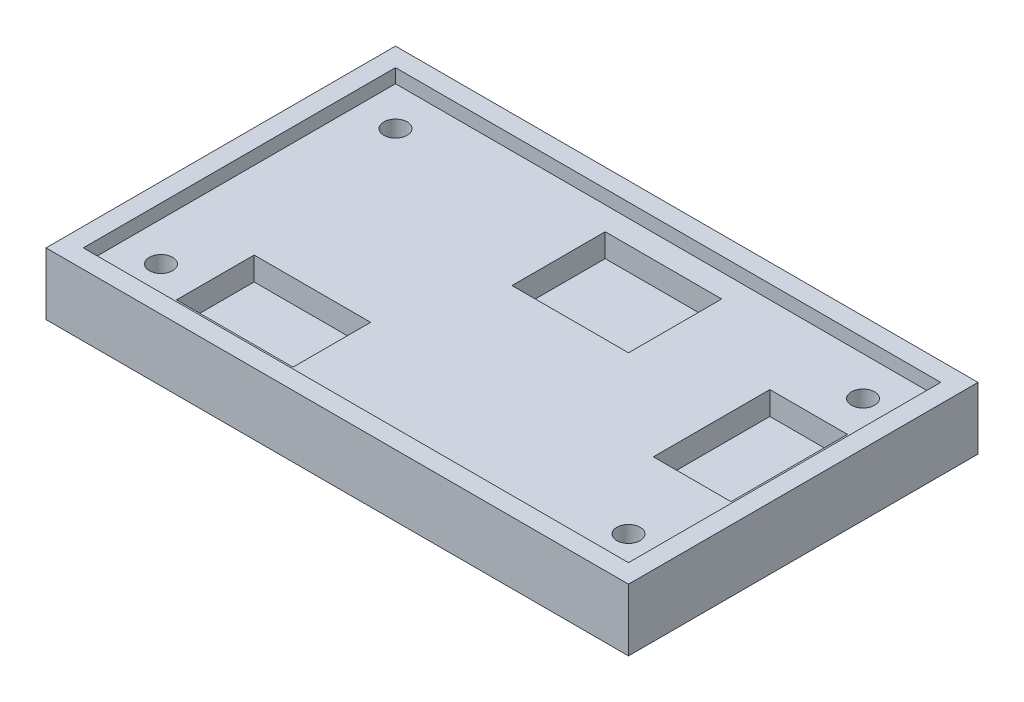
ISO-10303-21;
HEADER;
FILE_DESCRIPTION(('STEP AP214'),'2;1');
FILE_NAME('part.step','',(''),(''),'','','');
FILE_SCHEMA(('AUTOMOTIVE_DESIGN { 1 0 10303 214 1 1 1 1 }'));
ENDSEC;
DATA;
#1=APPLICATION_CONTEXT('core data for automotive mechanical design processes');
#2=APPLICATION_PROTOCOL_DEFINITION('international standard','automotive_design',2000,#1);
#3=PRODUCT_CONTEXT('',#1,'mechanical');
#4=PRODUCT('Part','Part','',(#3));
#5=PRODUCT_RELATED_PRODUCT_CATEGORY('part','',(#4));
#6=PRODUCT_DEFINITION_FORMATION('','',#4);
#7=PRODUCT_DEFINITION_CONTEXT('part definition',#1,'design');
#8=PRODUCT_DEFINITION('design','',#6,#7);
#9=PRODUCT_DEFINITION_SHAPE('','',#8);
#10=(LENGTH_UNIT() NAMED_UNIT(*) SI_UNIT(.MILLI.,.METRE.));
#11=(NAMED_UNIT(*) PLANE_ANGLE_UNIT() SI_UNIT($,.RADIAN.));
#12=(NAMED_UNIT(*) SI_UNIT($,.STERADIAN.) SOLID_ANGLE_UNIT());
#13=UNCERTAINTY_MEASURE_WITH_UNIT(LENGTH_MEASURE(1.E-05),#10,'distance_accuracy_value','');
#14=(GEOMETRIC_REPRESENTATION_CONTEXT(3) GLOBAL_UNCERTAINTY_ASSIGNED_CONTEXT((#13)) GLOBAL_UNIT_ASSIGNED_CONTEXT((#10,
#11,#12)) REPRESENTATION_CONTEXT('',''));
#15=CARTESIAN_POINT('',(0.,0.,0.));
#16=DIRECTION('',(0.,0.,1.));
#17=DIRECTION('',(1.,0.,0.));
#18=AXIS2_PLACEMENT_3D('',#15,#16,#17);
#19=CARTESIAN_POINT('',(0.,8.,-45.));
#20=DIRECTION('',(0.,0.,-1.));
#21=DIRECTION('',(-1.,0.,0.));
#22=AXIS2_PLACEMENT_3D('',#19,#20,#21);
#23=PLANE('',#22);
#24=DIRECTION('',(1.,0.,0.));
#25=VECTOR('',#24,1.);
#26=CARTESIAN_POINT('',(0.,0.,-45.));
#27=LINE('',#26,#25);
#28=CARTESIAN_POINT('',(0.,0.,-45.));
#29=VERTEX_POINT('',#28);
#30=CARTESIAN_POINT('',(75.,0.,-45.));
#31=VERTEX_POINT('',#30);
#32=EDGE_CURVE('E328',#29,#31,#27,.T.);
#33=ORIENTED_EDGE('',*,*,#32,.F.);
#34=DIRECTION('',(0.,-1.,0.));
#35=VECTOR('',#34,1.);
#36=CARTESIAN_POINT('',(0.,8.,-45.));
#37=LINE('',#36,#35);
#38=CARTESIAN_POINT('',(0.,8.,-45.));
#39=VERTEX_POINT('',#38);
#40=EDGE_CURVE('E11',#39,#29,#37,.T.);
#41=ORIENTED_EDGE('',*,*,#40,.F.);
#42=DIRECTION('',(1.,0.,0.));
#43=VECTOR('',#42,1.);
#44=CARTESIAN_POINT('',(0.,8.,-45.));
#45=LINE('',#44,#43);
#46=CARTESIAN_POINT('',(75.,8.,-45.));
#47=VERTEX_POINT('',#46);
#48=EDGE_CURVE('E335',#39,#47,#45,.T.);
#49=ORIENTED_EDGE('',*,*,#48,.T.);
#50=DIRECTION('',(0.,-1.,0.));
#51=VECTOR('',#50,1.);
#52=CARTESIAN_POINT('',(75.,8.,-45.));
#53=LINE('',#52,#51);
#54=EDGE_CURVE('E44',#47,#31,#53,.T.);
#55=ORIENTED_EDGE('',*,*,#54,.T.);
#56=EDGE_LOOP('',(#33,#41,#49,#55));
#57=FACE_BOUND('',#56,.T.);
#58=ADVANCED_FACE('F41',(#57),#23,.T.);
#59=CARTESIAN_POINT('',(0.,8.,0.));
#60=DIRECTION('',(-1.,0.,0.));
#61=DIRECTION('',(0.,0.,1.));
#62=AXIS2_PLACEMENT_3D('',#59,#60,#61);
#63=PLANE('',#62);
#64=DIRECTION('',(0.,0.,-1.));
#65=VECTOR('',#64,1.);
#66=CARTESIAN_POINT('',(0.,0.,0.));
#67=LINE('',#66,#65);
#68=CARTESIAN_POINT('',(0.,0.,0.));
#69=VERTEX_POINT('',#68);
#70=EDGE_CURVE('E339',#69,#29,#67,.T.);
#71=ORIENTED_EDGE('',*,*,#70,.F.);
#72=DIRECTION('',(0.,-1.,0.));
#73=VECTOR('',#72,1.);
#74=CARTESIAN_POINT('',(0.,8.,0.));
#75=LINE('',#74,#73);
#76=CARTESIAN_POINT('',(0.,8.,0.));
#77=VERTEX_POINT('',#76);
#78=EDGE_CURVE('E49',#77,#69,#75,.T.);
#79=ORIENTED_EDGE('',*,*,#78,.F.);
#80=DIRECTION('',(0.,0.,-1.));
#81=VECTOR('',#80,1.);
#82=CARTESIAN_POINT('',(0.,8.,0.));
#83=LINE('',#82,#81);
#84=EDGE_CURVE('E343',#77,#39,#83,.T.);
#85=ORIENTED_EDGE('',*,*,#84,.T.);
#86=ORIENTED_EDGE('',*,*,#40,.T.);
#87=EDGE_LOOP('',(#71,#79,#85,#86));
#88=FACE_BOUND('',#87,.T.);
#89=ADVANCED_FACE('F371',(#88),#63,.T.);
#90=CARTESIAN_POINT('',(0.,8.,0.));
#91=DIRECTION('',(0.,0.,-1.));
#92=DIRECTION('',(-1.,0.,0.));
#93=AXIS2_PLACEMENT_3D('',#90,#91,#92);
#94=PLANE('',#93);
#95=DIRECTION('',(1.,0.,0.));
#96=VECTOR('',#95,1.);
#97=CARTESIAN_POINT('',(0.,0.,0.));
#98=LINE('',#97,#96);
#99=CARTESIAN_POINT('',(75.,0.,0.));
#100=VERTEX_POINT('',#99);
#101=EDGE_CURVE('E351',#69,#100,#98,.T.);
#102=ORIENTED_EDGE('',*,*,#101,.T.);
#103=DIRECTION('',(0.,-1.,0.));
#104=VECTOR('',#103,1.);
#105=CARTESIAN_POINT('',(75.,8.,0.));
#106=LINE('',#105,#104);
#107=CARTESIAN_POINT('',(75.,8.,0.));
#108=VERTEX_POINT('',#107);
#109=EDGE_CURVE('E355',#108,#100,#106,.T.);
#110=ORIENTED_EDGE('',*,*,#109,.F.);
#111=DIRECTION('',(1.,0.,0.));
#112=VECTOR('',#111,1.);
#113=CARTESIAN_POINT('',(0.,8.,0.));
#114=LINE('',#113,#112);
#115=EDGE_CURVE('E341',#77,#108,#114,.T.);
#116=ORIENTED_EDGE('',*,*,#115,.F.);
#117=ORIENTED_EDGE('',*,*,#78,.T.);
#118=EDGE_LOOP('',(#102,#110,#116,#117));
#119=FACE_BOUND('',#118,.T.);
#120=ADVANCED_FACE('F377',(#119),#94,.F.);
#121=CARTESIAN_POINT('',(75.,8.,0.));
#122=DIRECTION('',(-1.,0.,0.));
#123=DIRECTION('',(0.,0.,1.));
#124=AXIS2_PLACEMENT_3D('',#121,#122,#123);
#125=PLANE('',#124);
#126=DIRECTION('',(0.,0.,-1.));
#127=VECTOR('',#126,1.);
#128=CARTESIAN_POINT('',(75.,0.,0.));
#129=LINE('',#128,#127);
#130=EDGE_CURVE('E348',#100,#31,#129,.T.);
#131=ORIENTED_EDGE('',*,*,#130,.T.);
#132=ORIENTED_EDGE('',*,*,#54,.F.);
#133=DIRECTION('',(0.,0.,-1.));
#134=VECTOR('',#133,1.);
#135=CARTESIAN_POINT('',(75.,8.,0.));
#136=LINE('',#135,#134);
#137=EDGE_CURVE('E338',#108,#47,#136,.T.);
#138=ORIENTED_EDGE('',*,*,#137,.F.);
#139=ORIENTED_EDGE('',*,*,#109,.T.);
#140=EDGE_LOOP('',(#131,#132,#138,#139));
#141=FACE_BOUND('',#140,.T.);
#142=ADVANCED_FACE('F365',(#141),#125,.F.);
#143=CARTESIAN_POINT('',(0.,8.,0.));
#144=DIRECTION('',(0.,1.,0.));
#145=DIRECTION('',(0.,0.,1.));
#146=AXIS2_PLACEMENT_3D('',#143,#144,#145);
#147=PLANE('',#146);
#148=DIRECTION('',(0.,0.,1.));
#149=VECTOR('',#148,1.);
#150=CARTESIAN_POINT('',(2.4,8.,-42.6));
#151=LINE('',#150,#149);
#152=CARTESIAN_POINT('',(2.4,8.,-42.6));
#153=VERTEX_POINT('',#152);
#154=CARTESIAN_POINT('',(2.4,8.,-2.4));
#155=VERTEX_POINT('',#154);
#156=EDGE_CURVE('E300',#153,#155,#151,.T.);
#157=ORIENTED_EDGE('',*,*,#156,.F.);
#158=DIRECTION('',(-1.,0.,0.));
#159=VECTOR('',#158,1.);
#160=CARTESIAN_POINT('',(72.6,8.,-42.6));
#161=LINE('',#160,#159);
#162=CARTESIAN_POINT('',(72.6,8.,-42.6));
#163=VERTEX_POINT('',#162);
#164=EDGE_CURVE('E307',#163,#153,#161,.T.);
#165=ORIENTED_EDGE('',*,*,#164,.F.);
#166=DIRECTION('',(0.,0.,-1.));
#167=VECTOR('',#166,1.);
#168=CARTESIAN_POINT('',(72.6,8.,-2.4));
#169=LINE('',#168,#167);
#170=CARTESIAN_POINT('',(72.6,8.,-2.4));
#171=VERTEX_POINT('',#170);
#172=EDGE_CURVE('E321',#171,#163,#169,.T.);
#173=ORIENTED_EDGE('',*,*,#172,.F.);
#174=DIRECTION('',(1.,0.,0.));
#175=VECTOR('',#174,1.);
#176=CARTESIAN_POINT('',(2.4,8.,-2.4));
#177=LINE('',#176,#175);
#178=EDGE_CURVE('E318',#155,#171,#177,.T.);
#179=ORIENTED_EDGE('',*,*,#178,.F.);
#180=EDGE_LOOP('',(#157,#165,#173,#179));
#181=FACE_BOUND('',#180,.T.);
#182=ORIENTED_EDGE('',*,*,#48,.F.);
#183=ORIENTED_EDGE('',*,*,#84,.F.);
#184=ORIENTED_EDGE('',*,*,#115,.T.);
#185=ORIENTED_EDGE('',*,*,#137,.T.);
#186=EDGE_LOOP('',(#182,#183,#184,#185));
#187=FACE_BOUND('',#186,.T.);
#188=ADVANCED_FACE('F375',(#181,#187),#147,.T.);
#189=CARTESIAN_POINT('',(0.,0.,0.));
#190=DIRECTION('',(0.,1.,0.));
#191=DIRECTION('',(0.,0.,1.));
#192=AXIS2_PLACEMENT_3D('',#189,#190,#191);
#193=PLANE('',#192);
#194=ORIENTED_EDGE('',*,*,#32,.T.);
#195=ORIENTED_EDGE('',*,*,#130,.F.);
#196=ORIENTED_EDGE('',*,*,#101,.F.);
#197=ORIENTED_EDGE('',*,*,#70,.T.);
#198=EDGE_LOOP('',(#194,#195,#196,#197));
#199=FACE_BOUND('',#198,.T.);
#200=ADVANCED_FACE('F368',(#199),#193,.F.);
#201=CARTESIAN_POINT('',(2.4,6.2,-42.6));
#202=DIRECTION('',(-1.,0.,0.));
#203=DIRECTION('',(0.,0.,1.));
#204=AXIS2_PLACEMENT_3D('',#201,#202,#203);
#205=PLANE('',#204);
#206=ORIENTED_EDGE('',*,*,#156,.T.);
#207=DIRECTION('',(0.,1.,0.));
#208=VECTOR('',#207,1.);
#209=CARTESIAN_POINT('',(2.4,6.2,-2.4));
#210=LINE('',#209,#208);
#211=CARTESIAN_POINT('',(2.4,6.2,-2.4));
#212=VERTEX_POINT('',#211);
#213=EDGE_CURVE('E316',#212,#155,#210,.T.);
#214=ORIENTED_EDGE('',*,*,#213,.F.);
#215=DIRECTION('',(0.,0.,1.));
#216=VECTOR('',#215,1.);
#217=CARTESIAN_POINT('',(2.4,6.2,-42.6));
#218=LINE('',#217,#216);
#219=CARTESIAN_POINT('',(2.4,6.2,-42.6));
#220=VERTEX_POINT('',#219);
#221=EDGE_CURVE('E303',#220,#212,#218,.T.);
#222=ORIENTED_EDGE('',*,*,#221,.F.);
#223=DIRECTION('',(0.,1.,0.));
#224=VECTOR('',#223,1.);
#225=CARTESIAN_POINT('',(2.4,6.2,-42.6));
#226=LINE('',#225,#224);
#227=EDGE_CURVE('E326',#220,#153,#226,.T.);
#228=ORIENTED_EDGE('',*,*,#227,.T.);
#229=EDGE_LOOP('',(#206,#214,#222,#228));
#230=FACE_BOUND('',#229,.T.);
#231=ADVANCED_FACE('F423',(#230),#205,.F.);
#232=CARTESIAN_POINT('',(72.6,6.2,-42.6));
#233=DIRECTION('',(0.,0.,-1.));
#234=DIRECTION('',(-1.,0.,0.));
#235=AXIS2_PLACEMENT_3D('',#232,#233,#234);
#236=PLANE('',#235);
#237=ORIENTED_EDGE('',*,*,#164,.T.);
#238=ORIENTED_EDGE('',*,*,#227,.F.);
#239=DIRECTION('',(-1.,0.,0.));
#240=VECTOR('',#239,1.);
#241=CARTESIAN_POINT('',(72.6,6.2,-42.6));
#242=LINE('',#241,#240);
#243=CARTESIAN_POINT('',(72.6,6.2,-42.6));
#244=VERTEX_POINT('',#243);
#245=EDGE_CURVE('E313',#244,#220,#242,.T.);
#246=ORIENTED_EDGE('',*,*,#245,.F.);
#247=DIRECTION('',(0.,1.,0.));
#248=VECTOR('',#247,1.);
#249=CARTESIAN_POINT('',(72.6,6.2,-42.6));
#250=LINE('',#249,#248);
#251=EDGE_CURVE('E329',#244,#163,#250,.T.);
#252=ORIENTED_EDGE('',*,*,#251,.T.);
#253=EDGE_LOOP('',(#237,#238,#246,#252));
#254=FACE_BOUND('',#253,.T.);
#255=ADVANCED_FACE('F431',(#254),#236,.F.);
#256=CARTESIAN_POINT('',(72.6,6.2,-2.4));
#257=DIRECTION('',(1.,0.,0.));
#258=DIRECTION('',(0.,0.,-1.));
#259=AXIS2_PLACEMENT_3D('',#256,#257,#258);
#260=PLANE('',#259);
#261=ORIENTED_EDGE('',*,*,#172,.T.);
#262=ORIENTED_EDGE('',*,*,#251,.F.);
#263=DIRECTION('',(0.,0.,-1.));
#264=VECTOR('',#263,1.);
#265=CARTESIAN_POINT('',(72.6,6.2,-2.4));
#266=LINE('',#265,#264);
#267=CARTESIAN_POINT('',(72.6,6.2,-2.4));
#268=VERTEX_POINT('',#267);
#269=EDGE_CURVE('E310',#268,#244,#266,.T.);
#270=ORIENTED_EDGE('',*,*,#269,.F.);
#271=DIRECTION('',(0.,1.,0.));
#272=VECTOR('',#271,1.);
#273=CARTESIAN_POINT('',(72.6,6.2,-2.4));
#274=LINE('',#273,#272);
#275=EDGE_CURVE('E331',#268,#171,#274,.T.);
#276=ORIENTED_EDGE('',*,*,#275,.T.);
#277=EDGE_LOOP('',(#261,#262,#270,#276));
#278=FACE_BOUND('',#277,.T.);
#279=ADVANCED_FACE('F441',(#278),#260,.F.);
#280=CARTESIAN_POINT('',(2.4,6.2,-2.4));
#281=DIRECTION('',(0.,0.,1.));
#282=DIRECTION('',(1.,0.,0.));
#283=AXIS2_PLACEMENT_3D('',#280,#281,#282);
#284=PLANE('',#283);
#285=ORIENTED_EDGE('',*,*,#178,.T.);
#286=ORIENTED_EDGE('',*,*,#275,.F.);
#287=DIRECTION('',(1.,0.,0.));
#288=VECTOR('',#287,1.);
#289=CARTESIAN_POINT('',(2.4,6.2,-2.4));
#290=LINE('',#289,#288);
#291=EDGE_CURVE('E306',#212,#268,#290,.T.);
#292=ORIENTED_EDGE('',*,*,#291,.F.);
#293=ORIENTED_EDGE('',*,*,#213,.T.);
#294=EDGE_LOOP('',(#285,#286,#292,#293));
#295=FACE_BOUND('',#294,.T.);
#296=ADVANCED_FACE('F451',(#295),#284,.F.);
#297=CARTESIAN_POINT('',(0.,6.2,0.));
#298=DIRECTION('',(0.,1.,0.));
#299=DIRECTION('',(0.,0.,1.));
#300=AXIS2_PLACEMENT_3D('',#297,#298,#299);
#301=PLANE('',#300);
#302=DIRECTION('',(0.,0.,1.));
#303=VECTOR('',#302,1.);
#304=CARTESIAN_POINT('',(12.4,6.2,-14.4));
#305=LINE('',#304,#303);
#306=CARTESIAN_POINT('',(12.4,6.2,-14.4));
#307=VERTEX_POINT('',#306);
#308=CARTESIAN_POINT('',(12.4,6.2,-4.4));
#309=VERTEX_POINT('',#308);
#310=EDGE_CURVE('E57',#307,#309,#305,.T.);
#311=ORIENTED_EDGE('',*,*,#310,.F.);
#312=DIRECTION('',(-1.,0.,0.));
#313=VECTOR('',#312,1.);
#314=CARTESIAN_POINT('',(12.4,6.2,-14.4));
#315=LINE('',#314,#313);
#316=CARTESIAN_POINT('',(27.4,6.2,-14.4));
#317=VERTEX_POINT('',#316);
#318=EDGE_CURVE('E198',#317,#307,#315,.T.);
#319=ORIENTED_EDGE('',*,*,#318,.F.);
#320=DIRECTION('',(0.,0.,-1.));
#321=VECTOR('',#320,1.);
#322=CARTESIAN_POINT('',(27.4,6.2,-14.4));
#323=LINE('',#322,#321);
#324=CARTESIAN_POINT('',(27.4,6.2,-4.4));
#325=VERTEX_POINT('',#324);
#326=EDGE_CURVE('E201',#325,#317,#323,.T.);
#327=ORIENTED_EDGE('',*,*,#326,.F.);
#328=DIRECTION('',(1.,0.,0.));
#329=VECTOR('',#328,1.);
#330=CARTESIAN_POINT('',(12.4,6.2,-4.4));
#331=LINE('',#330,#329);
#332=EDGE_CURVE('E207',#309,#325,#331,.T.);
#333=ORIENTED_EDGE('',*,*,#332,.F.);
#334=EDGE_LOOP('',(#311,#319,#327,#333));
#335=FACE_BOUND('',#334,.T.);
#336=DIRECTION('',(0.,0.,1.));
#337=VECTOR('',#336,1.);
#338=CARTESIAN_POINT('',(60.6,6.2,-32.6));
#339=LINE('',#338,#337);
#340=CARTESIAN_POINT('',(60.6,6.2,-32.6));
#341=VERTEX_POINT('',#340);
#342=CARTESIAN_POINT('',(60.6,6.2,-17.6));
#343=VERTEX_POINT('',#342);
#344=EDGE_CURVE('E65',#341,#343,#339,.T.);
#345=ORIENTED_EDGE('',*,*,#344,.F.);
#346=DIRECTION('',(-1.,0.,0.));
#347=VECTOR('',#346,1.);
#348=CARTESIAN_POINT('',(60.6,6.2,-32.6));
#349=LINE('',#348,#347);
#350=CARTESIAN_POINT('',(70.6,6.2,-32.6));
#351=VERTEX_POINT('',#350);
#352=EDGE_CURVE('E227',#351,#341,#349,.T.);
#353=ORIENTED_EDGE('',*,*,#352,.F.);
#354=DIRECTION('',(0.,0.,-1.));
#355=VECTOR('',#354,1.);
#356=CARTESIAN_POINT('',(70.6,6.2,-32.6));
#357=LINE('',#356,#355);
#358=CARTESIAN_POINT('',(70.6,6.2,-17.6));
#359=VERTEX_POINT('',#358);
#360=EDGE_CURVE('E230',#359,#351,#357,.T.);
#361=ORIENTED_EDGE('',*,*,#360,.F.);
#362=DIRECTION('',(1.,0.,0.));
#363=VECTOR('',#362,1.);
#364=CARTESIAN_POINT('',(60.6,6.2,-17.6));
#365=LINE('',#364,#363);
#366=EDGE_CURVE('E234',#343,#359,#365,.T.);
#367=ORIENTED_EDGE('',*,*,#366,.F.);
#368=EDGE_LOOP('',(#345,#353,#361,#367));
#369=FACE_BOUND('',#368,.T.);
#370=DIRECTION('',(0.,0.,1.));
#371=VECTOR('',#370,1.);
#372=CARTESIAN_POINT('',(32.4,6.2,-39.6));
#373=LINE('',#372,#371);
#374=CARTESIAN_POINT('',(32.4,6.2,-39.6));
#375=VERTEX_POINT('',#374);
#376=CARTESIAN_POINT('',(32.4,6.2,-27.6));
#377=VERTEX_POINT('',#376);
#378=EDGE_CURVE('E226',#375,#377,#373,.T.);
#379=ORIENTED_EDGE('',*,*,#378,.F.);
#380=DIRECTION('',(-1.,0.,0.));
#381=VECTOR('',#380,1.);
#382=CARTESIAN_POINT('',(32.4,6.2,-39.6));
#383=LINE('',#382,#381);
#384=CARTESIAN_POINT('',(47.4,6.2,-39.6));
#385=VERTEX_POINT('',#384);
#386=EDGE_CURVE('E258',#385,#375,#383,.T.);
#387=ORIENTED_EDGE('',*,*,#386,.F.);
#388=DIRECTION('',(0.,0.,-1.));
#389=VECTOR('',#388,1.);
#390=CARTESIAN_POINT('',(47.4,6.2,-39.6));
#391=LINE('',#390,#389);
#392=CARTESIAN_POINT('',(47.4,6.2,-27.6));
#393=VERTEX_POINT('',#392);
#394=EDGE_CURVE('E261',#393,#385,#391,.T.);
#395=ORIENTED_EDGE('',*,*,#394,.F.);
#396=DIRECTION('',(1.,0.,0.));
#397=VECTOR('',#396,1.);
#398=CARTESIAN_POINT('',(32.4,6.2,-27.6));
#399=LINE('',#398,#397);
#400=EDGE_CURVE('E265',#377,#393,#399,.T.);
#401=ORIENTED_EDGE('',*,*,#400,.F.);
#402=EDGE_LOOP('',(#379,#387,#395,#401));
#403=FACE_BOUND('',#402,.T.);
#404=CARTESIAN_POINT('',(67.6,6.2,-37.6));
#405=DIRECTION('',(0.,1.,0.));
#406=DIRECTION('',(0.,0.,-1.));
#407=AXIS2_PLACEMENT_3D('',#404,#405,#406);
#408=CIRCLE('',#407,1.50000000000001);
#409=CARTESIAN_POINT('',(67.6,6.2,-39.1));
#410=VERTEX_POINT('',#409);
#411=EDGE_CURVE('E285',#410,#410,#408,.T.);
#412=ORIENTED_EDGE('',*,*,#411,.F.);
#413=EDGE_LOOP('',(#412));
#414=FACE_BOUND('',#413,.T.);
#415=CARTESIAN_POINT('',(7.4,6.2,-7.4));
#416=DIRECTION('',(0.,1.,0.));
#417=DIRECTION('',(0.,0.,-1.));
#418=AXIS2_PLACEMENT_3D('',#415,#416,#417);
#419=CIRCLE('',#418,1.5);
#420=CARTESIAN_POINT('',(7.4,6.2,-8.9));
#421=VERTEX_POINT('',#420);
#422=EDGE_CURVE('E292',#421,#421,#419,.T.);
#423=ORIENTED_EDGE('',*,*,#422,.F.);
#424=EDGE_LOOP('',(#423));
#425=FACE_BOUND('',#424,.T.);
#426=CARTESIAN_POINT('',(67.6,6.2,-7.4));
#427=DIRECTION('',(0.,1.,0.));
#428=DIRECTION('',(0.,0.,1.));
#429=AXIS2_PLACEMENT_3D('',#426,#427,#428);
#430=CIRCLE('',#429,1.50000000000001);
#431=CARTESIAN_POINT('',(67.6,6.2,-5.89999999999999));
#432=VERTEX_POINT('',#431);
#433=EDGE_CURVE('E279',#432,#432,#430,.T.);
#434=ORIENTED_EDGE('',*,*,#433,.F.);
#435=EDGE_LOOP('',(#434));
#436=FACE_BOUND('',#435,.T.);
#437=CARTESIAN_POINT('',(7.4,6.2,-37.6));
#438=DIRECTION('',(0.,1.,0.));
#439=DIRECTION('',(0.,0.,1.));
#440=AXIS2_PLACEMENT_3D('',#437,#438,#439);
#441=CIRCLE('',#440,1.5);
#442=CARTESIAN_POINT('',(7.4,6.2,-36.1));
#443=VERTEX_POINT('',#442);
#444=EDGE_CURVE('E288',#443,#443,#441,.T.);
#445=ORIENTED_EDGE('',*,*,#444,.F.);
#446=EDGE_LOOP('',(#445));
#447=FACE_BOUND('',#446,.T.);
#448=ORIENTED_EDGE('',*,*,#221,.T.);
#449=ORIENTED_EDGE('',*,*,#291,.T.);
#450=ORIENTED_EDGE('',*,*,#269,.T.);
#451=ORIENTED_EDGE('',*,*,#245,.T.);
#452=EDGE_LOOP('',(#448,#449,#450,#451));
#453=FACE_BOUND('',#452,.T.);
#454=ADVANCED_FACE('F461',(#335,#369,#403,#414,#425,#436,#447,#453),#301,.T.);
#455=CARTESIAN_POINT('',(7.4,4.,-37.6));
#456=DIRECTION('',(0.,1.,0.));
#457=DIRECTION('',(0.,0.,1.));
#458=AXIS2_PLACEMENT_3D('',#455,#456,#457);
#459=CYLINDRICAL_SURFACE('',#458,1.5);
#460=CARTESIAN_POINT('',(7.4,4.,-37.6));
#461=DIRECTION('',(0.,1.,0.));
#462=DIRECTION('',(0.,0.,1.));
#463=AXIS2_PLACEMENT_3D('',#460,#461,#462);
#464=CIRCLE('',#463,1.5);
#465=CARTESIAN_POINT('',(7.4,4.,-36.1));
#466=VERTEX_POINT('',#465);
#467=EDGE_CURVE('E297',#466,#466,#464,.T.);
#468=ORIENTED_EDGE('',*,*,#467,.F.);
#469=EDGE_LOOP('',(#468));
#470=FACE_BOUND('',#469,.T.);
#471=ORIENTED_EDGE('',*,*,#444,.T.);
#472=EDGE_LOOP('',(#471));
#473=FACE_BOUND('',#472,.T.);
#474=ADVANCED_FACE('F472',(#470,#473),#459,.F.);
#475=CARTESIAN_POINT('',(7.4,4.,-37.6));
#476=DIRECTION('',(0.,1.,0.));
#477=DIRECTION('',(0.,0.,1.));
#478=AXIS2_PLACEMENT_3D('',#475,#476,#477);
#479=PLANE('',#478);
#480=ORIENTED_EDGE('',*,*,#467,.T.);
#481=EDGE_LOOP('',(#480));
#482=FACE_BOUND('',#481,.T.);
#483=ADVANCED_FACE('F483',(#482),#479,.T.);
#484=CARTESIAN_POINT('',(67.6,4.,-7.4));
#485=DIRECTION('',(0.,1.,0.));
#486=DIRECTION('',(0.,0.,1.));
#487=AXIS2_PLACEMENT_3D('',#484,#485,#486);
#488=CYLINDRICAL_SURFACE('',#487,1.50000000000001);
#489=CARTESIAN_POINT('',(67.6,4.,-7.4));
#490=DIRECTION('',(0.,1.,0.));
#491=DIRECTION('',(0.,0.,1.));
#492=AXIS2_PLACEMENT_3D('',#489,#490,#491);
#493=CIRCLE('',#492,1.50000000000001);
#494=CARTESIAN_POINT('',(67.6,4.,-5.89999999999999));
#495=VERTEX_POINT('',#494);
#496=EDGE_CURVE('E213',#495,#495,#493,.T.);
#497=ORIENTED_EDGE('',*,*,#496,.F.);
#498=EDGE_LOOP('',(#497));
#499=FACE_BOUND('',#498,.T.);
#500=ORIENTED_EDGE('',*,*,#433,.T.);
#501=EDGE_LOOP('',(#500));
#502=FACE_BOUND('',#501,.T.);
#503=ADVANCED_FACE('F493',(#499,#502),#488,.F.);
#504=CARTESIAN_POINT('',(67.6,4.,-7.4));
#505=DIRECTION('',(0.,1.,0.));
#506=DIRECTION('',(0.,0.,1.));
#507=AXIS2_PLACEMENT_3D('',#504,#505,#506);
#508=PLANE('',#507);
#509=ORIENTED_EDGE('',*,*,#496,.T.);
#510=EDGE_LOOP('',(#509));
#511=FACE_BOUND('',#510,.T.);
#512=ADVANCED_FACE('F503',(#511),#508,.T.);
#513=CARTESIAN_POINT('',(7.4,4.,-7.4));
#514=DIRECTION('',(0.,1.,0.));
#515=DIRECTION('',(0.,0.,1.));
#516=AXIS2_PLACEMENT_3D('',#513,#514,#515);
#517=CYLINDRICAL_SURFACE('',#516,1.5);
#518=CARTESIAN_POINT('',(7.4,4.,-7.4));
#519=DIRECTION('',(0.,1.,0.));
#520=DIRECTION('',(0.,0.,-1.));
#521=AXIS2_PLACEMENT_3D('',#518,#519,#520);
#522=CIRCLE('',#521,1.5);
#523=CARTESIAN_POINT('',(7.4,4.,-8.9));
#524=VERTEX_POINT('',#523);
#525=EDGE_CURVE('E282',#524,#524,#522,.T.);
#526=ORIENTED_EDGE('',*,*,#525,.F.);
#527=EDGE_LOOP('',(#526));
#528=FACE_BOUND('',#527,.T.);
#529=ORIENTED_EDGE('',*,*,#422,.T.);
#530=EDGE_LOOP('',(#529));
#531=FACE_BOUND('',#530,.T.);
#532=ADVANCED_FACE('F513',(#528,#531),#517,.F.);
#533=CARTESIAN_POINT('',(7.4,4.,-7.4));
#534=DIRECTION('',(0.,-1.,0.));
#535=DIRECTION('',(0.,0.,-1.));
#536=AXIS2_PLACEMENT_3D('',#533,#534,#535);
#537=PLANE('',#536);
#538=ORIENTED_EDGE('',*,*,#525,.T.);
#539=EDGE_LOOP('',(#538));
#540=FACE_BOUND('',#539,.T.);
#541=ADVANCED_FACE('F523',(#540),#537,.F.);
#542=CARTESIAN_POINT('',(67.6,4.,-37.6));
#543=DIRECTION('',(0.,1.,0.));
#544=DIRECTION('',(0.,0.,1.));
#545=AXIS2_PLACEMENT_3D('',#542,#543,#544);
#546=CYLINDRICAL_SURFACE('',#545,1.50000000000001);
#547=CARTESIAN_POINT('',(67.6,4.,-37.6));
#548=DIRECTION('',(0.,1.,0.));
#549=DIRECTION('',(0.,0.,-1.));
#550=AXIS2_PLACEMENT_3D('',#547,#548,#549);
#551=CIRCLE('',#550,1.50000000000001);
#552=CARTESIAN_POINT('',(67.6,4.,-39.1));
#553=VERTEX_POINT('',#552);
#554=EDGE_CURVE('E289',#553,#553,#551,.T.);
#555=ORIENTED_EDGE('',*,*,#554,.F.);
#556=EDGE_LOOP('',(#555));
#557=FACE_BOUND('',#556,.T.);
#558=ORIENTED_EDGE('',*,*,#411,.T.);
#559=EDGE_LOOP('',(#558));
#560=FACE_BOUND('',#559,.T.);
#561=ADVANCED_FACE('F533',(#557,#560),#546,.F.);
#562=CARTESIAN_POINT('',(67.6,4.,-37.6));
#563=DIRECTION('',(0.,-1.,0.));
#564=DIRECTION('',(0.,0.,-1.));
#565=AXIS2_PLACEMENT_3D('',#562,#563,#564);
#566=PLANE('',#565);
#567=ORIENTED_EDGE('',*,*,#554,.T.);
#568=EDGE_LOOP('',(#567));
#569=FACE_BOUND('',#568,.T.);
#570=ADVANCED_FACE('F543',(#569),#566,.F.);
#571=CARTESIAN_POINT('',(32.4,3.2,-39.6));
#572=DIRECTION('',(-1.,0.,0.));
#573=DIRECTION('',(0.,0.,1.));
#574=AXIS2_PLACEMENT_3D('',#571,#572,#573);
#575=PLANE('',#574);
#576=ORIENTED_EDGE('',*,*,#378,.T.);
#577=DIRECTION('',(0.,1.,0.));
#578=VECTOR('',#577,1.);
#579=CARTESIAN_POINT('',(32.4,3.2,-27.6));
#580=LINE('',#579,#578);
#581=CARTESIAN_POINT('',(32.4,3.2,-27.6));
#582=VERTEX_POINT('',#581);
#583=EDGE_CURVE('E248',#582,#377,#580,.T.);
#584=ORIENTED_EDGE('',*,*,#583,.F.);
#585=DIRECTION('',(0.,0.,1.));
#586=VECTOR('',#585,1.);
#587=CARTESIAN_POINT('',(32.4,3.2,-39.6));
#588=LINE('',#587,#586);
#589=CARTESIAN_POINT('',(32.4,3.2,-39.6));
#590=VERTEX_POINT('',#589);
#591=EDGE_CURVE('E262',#590,#582,#588,.T.);
#592=ORIENTED_EDGE('',*,*,#591,.F.);
#593=DIRECTION('',(0.,1.,0.));
#594=VECTOR('',#593,1.);
#595=CARTESIAN_POINT('',(32.4,3.2,-39.6));
#596=LINE('',#595,#594);
#597=EDGE_CURVE('E256',#590,#375,#596,.T.);
#598=ORIENTED_EDGE('',*,*,#597,.T.);
#599=EDGE_LOOP('',(#576,#584,#592,#598));
#600=FACE_BOUND('',#599,.T.);
#601=ADVANCED_FACE('F552',(#600),#575,.F.);
#602=CARTESIAN_POINT('',(32.4,3.2,-39.6));
#603=DIRECTION('',(0.,0.,-1.));
#604=DIRECTION('',(-1.,0.,0.));
#605=AXIS2_PLACEMENT_3D('',#602,#603,#604);
#606=PLANE('',#605);
#607=ORIENTED_EDGE('',*,*,#386,.T.);
#608=ORIENTED_EDGE('',*,*,#597,.F.);
#609=DIRECTION('',(-1.,0.,0.));
#610=VECTOR('',#609,1.);
#611=CARTESIAN_POINT('',(32.4,3.2,-39.6));
#612=LINE('',#611,#610);
#613=CARTESIAN_POINT('',(47.4,3.2,-39.6));
#614=VERTEX_POINT('',#613);
#615=EDGE_CURVE('E251',#614,#590,#612,.T.);
#616=ORIENTED_EDGE('',*,*,#615,.F.);
#617=DIRECTION('',(0.,1.,0.));
#618=VECTOR('',#617,1.);
#619=CARTESIAN_POINT('',(47.4,3.2,-39.6));
#620=LINE('',#619,#618);
#621=EDGE_CURVE('E254',#614,#385,#620,.T.);
#622=ORIENTED_EDGE('',*,*,#621,.T.);
#623=EDGE_LOOP('',(#607,#608,#616,#622));
#624=FACE_BOUND('',#623,.T.);
#625=ADVANCED_FACE('F561',(#624),#606,.F.);
#626=CARTESIAN_POINT('',(47.4,3.2,-39.6));
#627=DIRECTION('',(1.,0.,0.));
#628=DIRECTION('',(0.,0.,-1.));
#629=AXIS2_PLACEMENT_3D('',#626,#627,#628);
#630=PLANE('',#629);
#631=ORIENTED_EDGE('',*,*,#394,.T.);
#632=ORIENTED_EDGE('',*,*,#621,.F.);
#633=DIRECTION('',(0.,0.,-1.));
#634=VECTOR('',#633,1.);
#635=CARTESIAN_POINT('',(47.4,3.2,-39.6));
#636=LINE('',#635,#634);
#637=CARTESIAN_POINT('',(47.4,3.2,-27.6));
#638=VERTEX_POINT('',#637);
#639=EDGE_CURVE('E271',#638,#614,#636,.T.);
#640=ORIENTED_EDGE('',*,*,#639,.F.);
#641=DIRECTION('',(0.,1.,0.));
#642=VECTOR('',#641,1.);
#643=CARTESIAN_POINT('',(47.4,3.2,-27.6));
#644=LINE('',#643,#642);
#645=EDGE_CURVE('E252',#638,#393,#644,.T.);
#646=ORIENTED_EDGE('',*,*,#645,.T.);
#647=EDGE_LOOP('',(#631,#632,#640,#646));
#648=FACE_BOUND('',#647,.T.);
#649=ADVANCED_FACE('F571',(#648),#630,.F.);
#650=CARTESIAN_POINT('',(32.4,3.2,-27.6));
#651=DIRECTION('',(0.,0.,1.));
#652=DIRECTION('',(1.,0.,0.));
#653=AXIS2_PLACEMENT_3D('',#650,#651,#652);
#654=PLANE('',#653);
#655=ORIENTED_EDGE('',*,*,#400,.T.);
#656=ORIENTED_EDGE('',*,*,#645,.F.);
#657=DIRECTION('',(1.,0.,0.));
#658=VECTOR('',#657,1.);
#659=CARTESIAN_POINT('',(32.4,3.2,-27.6));
#660=LINE('',#659,#658);
#661=EDGE_CURVE('E274',#582,#638,#660,.T.);
#662=ORIENTED_EDGE('',*,*,#661,.F.);
#663=ORIENTED_EDGE('',*,*,#583,.T.);
#664=EDGE_LOOP('',(#655,#656,#662,#663));
#665=FACE_BOUND('',#664,.T.);
#666=ADVANCED_FACE('F581',(#665),#654,.F.);
#667=CARTESIAN_POINT('',(0.,3.2,0.));
#668=DIRECTION('',(0.,1.,0.));
#669=DIRECTION('',(0.,0.,1.));
#670=AXIS2_PLACEMENT_3D('',#667,#668,#669);
#671=PLANE('',#670);
#672=ORIENTED_EDGE('',*,*,#591,.T.);
#673=ORIENTED_EDGE('',*,*,#661,.T.);
#674=ORIENTED_EDGE('',*,*,#639,.T.);
#675=ORIENTED_EDGE('',*,*,#615,.T.);
#676=EDGE_LOOP('',(#672,#673,#674,#675));
#677=FACE_BOUND('',#676,.T.);
#678=ADVANCED_FACE('F591',(#677),#671,.T.);
#679=CARTESIAN_POINT('',(60.6,3.2,-32.6));
#680=DIRECTION('',(-1.,0.,0.));
#681=DIRECTION('',(0.,0.,1.));
#682=AXIS2_PLACEMENT_3D('',#679,#680,#681);
#683=PLANE('',#682);
#684=ORIENTED_EDGE('',*,*,#344,.T.);
#685=DIRECTION('',(0.,1.,0.));
#686=VECTOR('',#685,1.);
#687=CARTESIAN_POINT('',(60.6,3.2,-17.6));
#688=LINE('',#687,#686);
#689=CARTESIAN_POINT('',(60.6,3.2,-17.6));
#690=VERTEX_POINT('',#689);
#691=EDGE_CURVE('E217',#690,#343,#688,.T.);
#692=ORIENTED_EDGE('',*,*,#691,.F.);
#693=DIRECTION('',(0.,0.,1.));
#694=VECTOR('',#693,1.);
#695=CARTESIAN_POINT('',(60.6,3.2,-32.6));
#696=LINE('',#695,#694);
#697=CARTESIAN_POINT('',(60.6,3.2,-32.6));
#698=VERTEX_POINT('',#697);
#699=EDGE_CURVE('E231',#698,#690,#696,.T.);
#700=ORIENTED_EDGE('',*,*,#699,.F.);
#701=DIRECTION('',(0.,1.,0.));
#702=VECTOR('',#701,1.);
#703=CARTESIAN_POINT('',(60.6,3.2,-32.6));
#704=LINE('',#703,#702);
#705=EDGE_CURVE('E224',#698,#341,#704,.T.);
#706=ORIENTED_EDGE('',*,*,#705,.T.);
#707=EDGE_LOOP('',(#684,#692,#700,#706));
#708=FACE_BOUND('',#707,.T.);
#709=ADVANCED_FACE('F601',(#708),#683,.F.);
#710=CARTESIAN_POINT('',(60.6,3.2,-32.6));
#711=DIRECTION('',(0.,0.,-1.));
#712=DIRECTION('',(-1.,0.,0.));
#713=AXIS2_PLACEMENT_3D('',#710,#711,#712);
#714=PLANE('',#713);
#715=ORIENTED_EDGE('',*,*,#352,.T.);
#716=ORIENTED_EDGE('',*,*,#705,.F.);
#717=DIRECTION('',(-1.,0.,0.));
#718=VECTOR('',#717,1.);
#719=CARTESIAN_POINT('',(60.6,3.2,-32.6));
#720=LINE('',#719,#718);
#721=CARTESIAN_POINT('',(70.6,3.2,-32.6));
#722=VERTEX_POINT('',#721);
#723=EDGE_CURVE('E219',#722,#698,#720,.T.);
#724=ORIENTED_EDGE('',*,*,#723,.F.);
#725=DIRECTION('',(0.,1.,0.));
#726=VECTOR('',#725,1.);
#727=CARTESIAN_POINT('',(70.6,3.2,-32.6));
#728=LINE('',#727,#726);
#729=EDGE_CURVE('E222',#722,#351,#728,.T.);
#730=ORIENTED_EDGE('',*,*,#729,.T.);
#731=EDGE_LOOP('',(#715,#716,#724,#730));
#732=FACE_BOUND('',#731,.T.);
#733=ADVANCED_FACE('F611',(#732),#714,.F.);
#734=CARTESIAN_POINT('',(70.6,3.2,-32.6));
#735=DIRECTION('',(1.,0.,0.));
#736=DIRECTION('',(0.,0.,-1.));
#737=AXIS2_PLACEMENT_3D('',#734,#735,#736);
#738=PLANE('',#737);
#739=ORIENTED_EDGE('',*,*,#360,.T.);
#740=ORIENTED_EDGE('',*,*,#729,.F.);
#741=DIRECTION('',(0.,0.,-1.));
#742=VECTOR('',#741,1.);
#743=CARTESIAN_POINT('',(70.6,3.2,-32.6));
#744=LINE('',#743,#742);
#745=CARTESIAN_POINT('',(70.6,3.2,-17.6));
#746=VERTEX_POINT('',#745);
#747=EDGE_CURVE('E240',#746,#722,#744,.T.);
#748=ORIENTED_EDGE('',*,*,#747,.F.);
#749=DIRECTION('',(0.,1.,0.));
#750=VECTOR('',#749,1.);
#751=CARTESIAN_POINT('',(70.6,3.2,-17.6));
#752=LINE('',#751,#750);
#753=EDGE_CURVE('E220',#746,#359,#752,.T.);
#754=ORIENTED_EDGE('',*,*,#753,.T.);
#755=EDGE_LOOP('',(#739,#740,#748,#754));
#756=FACE_BOUND('',#755,.T.);
#757=ADVANCED_FACE('F620',(#756),#738,.F.);
#758=CARTESIAN_POINT('',(60.6,3.2,-17.6));
#759=DIRECTION('',(0.,0.,1.));
#760=DIRECTION('',(1.,0.,0.));
#761=AXIS2_PLACEMENT_3D('',#758,#759,#760);
#762=PLANE('',#761);
#763=ORIENTED_EDGE('',*,*,#366,.T.);
#764=ORIENTED_EDGE('',*,*,#753,.F.);
#765=DIRECTION('',(1.,0.,0.));
#766=VECTOR('',#765,1.);
#767=CARTESIAN_POINT('',(60.6,3.2,-17.6));
#768=LINE('',#767,#766);
#769=EDGE_CURVE('E243',#690,#746,#768,.T.);
#770=ORIENTED_EDGE('',*,*,#769,.F.);
#771=ORIENTED_EDGE('',*,*,#691,.T.);
#772=EDGE_LOOP('',(#763,#764,#770,#771));
#773=FACE_BOUND('',#772,.T.);
#774=ADVANCED_FACE('F630',(#773),#762,.F.);
#775=CARTESIAN_POINT('',(0.,3.2,0.));
#776=DIRECTION('',(0.,1.,0.));
#777=DIRECTION('',(0.,0.,1.));
#778=AXIS2_PLACEMENT_3D('',#775,#776,#777);
#779=PLANE('',#778);
#780=ORIENTED_EDGE('',*,*,#699,.T.);
#781=ORIENTED_EDGE('',*,*,#769,.T.);
#782=ORIENTED_EDGE('',*,*,#747,.T.);
#783=ORIENTED_EDGE('',*,*,#723,.T.);
#784=EDGE_LOOP('',(#780,#781,#782,#783));
#785=FACE_BOUND('',#784,.T.);
#786=ADVANCED_FACE('F640',(#785),#779,.T.);
#787=CARTESIAN_POINT('',(12.4,3.2,-14.4));
#788=DIRECTION('',(-1.,0.,0.));
#789=DIRECTION('',(0.,0.,1.));
#790=AXIS2_PLACEMENT_3D('',#787,#788,#789);
#791=PLANE('',#790);
#792=ORIENTED_EDGE('',*,*,#310,.T.);
#793=DIRECTION('',(0.,1.,0.));
#794=VECTOR('',#793,1.);
#795=CARTESIAN_POINT('',(12.4,3.2,-4.4));
#796=LINE('',#795,#794);
#797=CARTESIAN_POINT('',(12.4,3.2,-4.4));
#798=VERTEX_POINT('',#797);
#799=EDGE_CURVE('E176',#798,#309,#796,.T.);
#800=ORIENTED_EDGE('',*,*,#799,.F.);
#801=DIRECTION('',(0.,0.,1.));
#802=VECTOR('',#801,1.);
#803=CARTESIAN_POINT('',(12.4,3.2,-14.4));
#804=LINE('',#803,#802);
#805=CARTESIAN_POINT('',(12.4,3.2,-14.4));
#806=VERTEX_POINT('',#805);
#807=EDGE_CURVE('E180',#806,#798,#804,.T.);
#808=ORIENTED_EDGE('',*,*,#807,.F.);
#809=DIRECTION('',(0.,1.,0.));
#810=VECTOR('',#809,1.);
#811=CARTESIAN_POINT('',(12.4,3.2,-14.4));
#812=LINE('',#811,#810);
#813=EDGE_CURVE('E211',#806,#307,#812,.T.);
#814=ORIENTED_EDGE('',*,*,#813,.T.);
#815=EDGE_LOOP('',(#792,#800,#808,#814));
#816=FACE_BOUND('',#815,.T.);
#817=ADVANCED_FACE('F178',(#816),#791,.F.);
#818=CARTESIAN_POINT('',(12.4,3.2,-14.4));
#819=DIRECTION('',(0.,0.,-1.));
#820=DIRECTION('',(-1.,0.,0.));
#821=AXIS2_PLACEMENT_3D('',#818,#819,#820);
#822=PLANE('',#821);
#823=ORIENTED_EDGE('',*,*,#318,.T.);
#824=ORIENTED_EDGE('',*,*,#813,.F.);
#825=DIRECTION('',(-1.,0.,0.));
#826=VECTOR('',#825,1.);
#827=CARTESIAN_POINT('',(12.4,3.2,-14.4));
#828=LINE('',#827,#826);
#829=CARTESIAN_POINT('',(27.4,3.2,-14.4));
#830=VERTEX_POINT('',#829);
#831=EDGE_CURVE('E186',#830,#806,#828,.T.);
#832=ORIENTED_EDGE('',*,*,#831,.F.);
#833=DIRECTION('',(0.,1.,0.));
#834=VECTOR('',#833,1.);
#835=CARTESIAN_POINT('',(27.4,3.2,-14.4));
#836=LINE('',#835,#834);
#837=EDGE_CURVE('E214',#830,#317,#836,.T.);
#838=ORIENTED_EDGE('',*,*,#837,.T.);
#839=EDGE_LOOP('',(#823,#824,#832,#838));
#840=FACE_BOUND('',#839,.T.);
#841=ADVANCED_FACE('F659',(#840),#822,.F.);
#842=CARTESIAN_POINT('',(27.4,3.2,-14.4));
#843=DIRECTION('',(1.,0.,0.));
#844=DIRECTION('',(0.,0.,-1.));
#845=AXIS2_PLACEMENT_3D('',#842,#843,#844);
#846=PLANE('',#845);
#847=ORIENTED_EDGE('',*,*,#326,.T.);
#848=ORIENTED_EDGE('',*,*,#837,.F.);
#849=DIRECTION('',(0.,0.,-1.));
#850=VECTOR('',#849,1.);
#851=CARTESIAN_POINT('',(27.4,3.2,-14.4));
#852=LINE('',#851,#850);
#853=CARTESIAN_POINT('',(27.4,3.2,-4.4));
#854=VERTEX_POINT('',#853);
#855=EDGE_CURVE('E194',#854,#830,#852,.T.);
#856=ORIENTED_EDGE('',*,*,#855,.F.);
#857=DIRECTION('',(0.,1.,0.));
#858=VECTOR('',#857,1.);
#859=CARTESIAN_POINT('',(27.4,3.2,-4.4));
#860=LINE('',#859,#858);
#861=EDGE_CURVE('E185',#854,#325,#860,.T.);
#862=ORIENTED_EDGE('',*,*,#861,.T.);
#863=EDGE_LOOP('',(#847,#848,#856,#862));
#864=FACE_BOUND('',#863,.T.);
#865=ADVANCED_FACE('F668',(#864),#846,.F.);
#866=CARTESIAN_POINT('',(12.4,3.2,-4.4));
#867=DIRECTION('',(0.,0.,1.));
#868=DIRECTION('',(1.,0.,0.));
#869=AXIS2_PLACEMENT_3D('',#866,#867,#868);
#870=PLANE('',#869);
#871=ORIENTED_EDGE('',*,*,#332,.T.);
#872=ORIENTED_EDGE('',*,*,#861,.F.);
#873=DIRECTION('',(1.,0.,0.));
#874=VECTOR('',#873,1.);
#875=CARTESIAN_POINT('',(12.4,3.2,-4.4));
#876=LINE('',#875,#874);
#877=EDGE_CURVE('E189',#798,#854,#876,.T.);
#878=ORIENTED_EDGE('',*,*,#877,.F.);
#879=ORIENTED_EDGE('',*,*,#799,.T.);
#880=EDGE_LOOP('',(#871,#872,#878,#879));
#881=FACE_BOUND('',#880,.T.);
#882=ADVANCED_FACE('F190',(#881),#870,.F.);
#883=CARTESIAN_POINT('',(0.,3.2,0.));
#884=DIRECTION('',(0.,1.,0.));
#885=DIRECTION('',(0.,0.,1.));
#886=AXIS2_PLACEMENT_3D('',#883,#884,#885);
#887=PLANE('',#886);
#888=ORIENTED_EDGE('',*,*,#807,.T.);
#889=ORIENTED_EDGE('',*,*,#877,.T.);
#890=ORIENTED_EDGE('',*,*,#855,.T.);
#891=ORIENTED_EDGE('',*,*,#831,.T.);
#892=EDGE_LOOP('',(#888,#889,#890,#891));
#893=FACE_BOUND('',#892,.T.);
#894=ADVANCED_FACE('F196',(#893),#887,.T.);
#895=CLOSED_SHELL('',(#58,#89,#120,#142,#188,#200,#231,#255,#279,#296,#454,#474,#483,#503,#512,
#532,#541,#561,#570,#601,#625,#649,#666,#678,#709,#733,#757,#774,#786,#817,#841,#865,#882,#894));
#896=MANIFOLD_SOLID_BREP('B2',#895);
#897=ADVANCED_BREP_SHAPE_REPRESENTATION('',(#18,#896),#14);
#898=SHAPE_DEFINITION_REPRESENTATION(#9,#897);
ENDSEC;
END-ISO-10303-21;
